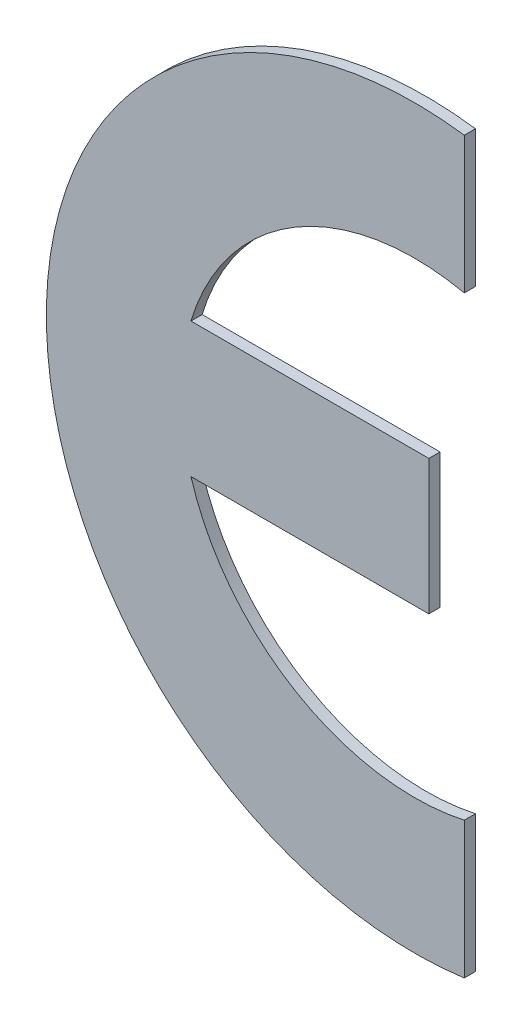
ISO-10303-21;
HEADER;
FILE_DESCRIPTION(('STEP AP214'),'2;1');
FILE_NAME('part.step','',(''),(''),'','','');
FILE_SCHEMA(('AUTOMOTIVE_DESIGN { 1 0 10303 214 1 1 1 1 }'));
ENDSEC;
DATA;
#1=APPLICATION_CONTEXT('core data for automotive mechanical design processes');
#2=APPLICATION_PROTOCOL_DEFINITION('international standard','automotive_design',2000,#1);
#3=PRODUCT_CONTEXT('',#1,'mechanical');
#4=PRODUCT('Part','Part','',(#3));
#5=PRODUCT_RELATED_PRODUCT_CATEGORY('part','',(#4));
#6=PRODUCT_DEFINITION_FORMATION('','',#4);
#7=PRODUCT_DEFINITION_CONTEXT('part definition',#1,'design');
#8=PRODUCT_DEFINITION('design','',#6,#7);
#9=PRODUCT_DEFINITION_SHAPE('','',#8);
#10=(LENGTH_UNIT() NAMED_UNIT(*) SI_UNIT(.MILLI.,.METRE.));
#11=(NAMED_UNIT(*) PLANE_ANGLE_UNIT() SI_UNIT($,.RADIAN.));
#12=(NAMED_UNIT(*) SI_UNIT($,.STERADIAN.) SOLID_ANGLE_UNIT());
#13=UNCERTAINTY_MEASURE_WITH_UNIT(LENGTH_MEASURE(1.E-05),#10,'distance_accuracy_value','');
#14=(GEOMETRIC_REPRESENTATION_CONTEXT(3) GLOBAL_UNCERTAINTY_ASSIGNED_CONTEXT((#13)) GLOBAL_UNIT_ASSIGNED_CONTEXT((#10,
#11,#12)) REPRESENTATION_CONTEXT('',''));
#15=CARTESIAN_POINT('',(0.,0.,0.));
#16=DIRECTION('',(0.,0.,1.));
#17=DIRECTION('',(1.,0.,0.));
#18=AXIS2_PLACEMENT_3D('',#15,#16,#17);
#19=CARTESIAN_POINT('',(0.,0.,0.05));
#20=DIRECTION('',(0.,0.,1.));
#21=DIRECTION('',(1.,0.,0.));
#22=AXIS2_PLACEMENT_3D('',#19,#20,#21);
#23=PLANE('',#22);
#24=DIRECTION('',(1.,0.,0.));
#25=VECTOR('',#24,1.);
#26=CARTESIAN_POINT('',(0.,0.328359,0.05));
#27=LINE('',#26,#25);
#28=CARTESIAN_POINT('',(1.982823,0.328359,0.05));
#29=VERTEX_POINT('',#28);
#30=CARTESIAN_POINT('',(0.920420256608206,0.328359,0.05));
#31=VERTEX_POINT('',#30);
#32=EDGE_CURVE('E102',#29,#31,#27,.F.);
#33=ORIENTED_EDGE('',*,*,#32,.T.);
#34=CARTESIAN_POINT('',(1.919323509045,0.02771641749802,0.05));
#35=DIRECTION('',(0.,0.,1.));
#36=DIRECTION('',(1.,0.,0.));
#37=AXIS2_PLACEMENT_3D('',#34,#35,#36);
#38=CIRCLE('',#37,1.043165217088);
#39=CARTESIAN_POINT('',(2.140918,1.04707383848436,0.05));
#40=VERTEX_POINT('',#39);
#41=EDGE_CURVE('E126',#31,#40,#38,.F.);
#42=ORIENTED_EDGE('',*,*,#41,.T.);
#43=DIRECTION('',(0.,1.,0.));
#44=VECTOR('',#43,1.);
#45=CARTESIAN_POINT('',(2.140918,1.047073838484,0.05));
#46=LINE('',#45,#44);
#47=CARTESIAN_POINT('',(2.14091799999997,1.65716686517852,0.05));
#48=VERTEX_POINT('',#47);
#49=EDGE_CURVE('E128',#48,#40,#46,.F.);
#50=ORIENTED_EDGE('',*,*,#49,.F.);
#51=CARTESIAN_POINT('',(1.919322613215,0.0277175,0.05));
#52=DIRECTION('',(0.,0.,1.));
#53=DIRECTION('',(1.,0.,0.));
#54=AXIS2_PLACEMENT_3D('',#51,#52,#53);
#55=CIRCLE('',#54,1.644448159452);
#56=CARTESIAN_POINT('',(2.140918,-1.60173186517876,0.05));
#57=VERTEX_POINT('',#56);
#58=EDGE_CURVE('E123',#57,#48,#55,.F.);
#59=ORIENTED_EDGE('',*,*,#58,.F.);
#60=DIRECTION('',(0.,1.,0.));
#61=VECTOR('',#60,1.);
#62=CARTESIAN_POINT('',(2.140918,0.,0.05));
#63=LINE('',#62,#61);
#64=CARTESIAN_POINT('',(2.14091800000002,-0.991637560477028,0.05));
#65=VERTEX_POINT('',#64);
#66=EDGE_CURVE('E79',#57,#65,#63,.T.);
#67=ORIENTED_EDGE('',*,*,#66,.T.);
#68=CARTESIAN_POINT('',(1.91932029307,0.02771576818233,0.05));
#69=DIRECTION('',(0.,0.,1.));
#70=DIRECTION('',(1.,0.,0.));
#71=AXIS2_PLACEMENT_3D('',#68,#69,#70);
#72=CIRCLE('',#71,1.04316190132);
#73=CARTESIAN_POINT('',(0.920420258236902,-0.272926,0.05));
#74=VERTEX_POINT('',#73);
#75=EDGE_CURVE('E20',#65,#74,#72,.F.);
#76=ORIENTED_EDGE('',*,*,#75,.T.);
#77=DIRECTION('',(1.,0.,0.));
#78=VECTOR('',#77,1.);
#79=CARTESIAN_POINT('',(0.,-0.272926,0.05));
#80=LINE('',#79,#78);
#81=CARTESIAN_POINT('',(1.982823,-0.272926,0.05));
#82=VERTEX_POINT('',#81);
#83=EDGE_CURVE('E84',#74,#82,#80,.T.);
#84=ORIENTED_EDGE('',*,*,#83,.T.);
#85=DIRECTION('',(0.,1.,0.));
#86=VECTOR('',#85,1.);
#87=CARTESIAN_POINT('',(1.982823,0.,0.05));
#88=LINE('',#87,#86);
#89=EDGE_CURVE('E100',#82,#29,#88,.T.);
#90=ORIENTED_EDGE('',*,*,#89,.T.);
#91=EDGE_LOOP('',(#33,#42,#50,#59,#67,#76,#84,#90));
#92=FACE_BOUND('',#91,.T.);
#93=ADVANCED_FACE('F17',(#92),#23,.T.);
#94=CARTESIAN_POINT('',(1.919323509045,0.02771641749802,0.));
#95=DIRECTION('',(0.,0.,1.));
#96=DIRECTION('',(1.,0.,0.));
#97=AXIS2_PLACEMENT_3D('',#94,#95,#96);
#98=CYLINDRICAL_SURFACE('',#97,1.043165217088);
#99=ORIENTED_EDGE('',*,*,#41,.F.);
#100=DIRECTION('',(0.,0.,1.));
#101=VECTOR('',#100,1.);
#102=CARTESIAN_POINT('',(0.9204202566082,0.328359,0.));
#103=LINE('',#102,#101);
#104=CARTESIAN_POINT('',(0.920420256608206,0.328359,0.));
#105=VERTEX_POINT('',#104);
#106=EDGE_CURVE('E142',#105,#31,#103,.T.);
#107=ORIENTED_EDGE('',*,*,#106,.F.);
#108=CARTESIAN_POINT('',(1.919323509045,0.02771641749802,0.));
#109=DIRECTION('',(0.,0.,1.));
#110=DIRECTION('',(1.,0.,0.));
#111=AXIS2_PLACEMENT_3D('',#108,#109,#110);
#112=CIRCLE('',#111,1.043165217088);
#113=CARTESIAN_POINT('',(2.140918,1.04707383848436,0.));
#114=VERTEX_POINT('',#113);
#115=EDGE_CURVE('E120',#105,#114,#112,.F.);
#116=ORIENTED_EDGE('',*,*,#115,.T.);
#117=DIRECTION('',(0.,0.,-1.));
#118=VECTOR('',#117,1.);
#119=CARTESIAN_POINT('',(2.140918,1.047073838484,0.));
#120=LINE('',#119,#118);
#121=EDGE_CURVE('E125',#40,#114,#120,.T.);
#122=ORIENTED_EDGE('',*,*,#121,.F.);
#123=EDGE_LOOP('',(#99,#107,#116,#122));
#124=FACE_BOUND('',#123,.T.);
#125=ADVANCED_FACE('F169',(#124),#98,.F.);
#126=CARTESIAN_POINT('',(2.140918,1.047073838484,0.));
#127=DIRECTION('',(1.,0.,0.));
#128=DIRECTION('',(0.,0.,-1.));
#129=AXIS2_PLACEMENT_3D('',#126,#127,#128);
#130=PLANE('',#129);
#131=ORIENTED_EDGE('',*,*,#121,.T.);
#132=DIRECTION('',(0.,1.,0.));
#133=VECTOR('',#132,1.);
#134=CARTESIAN_POINT('',(2.140918,0.,0.));
#135=LINE('',#134,#133);
#136=CARTESIAN_POINT('',(2.14091799999997,1.65716686517852,0.));
#137=VERTEX_POINT('',#136);
#138=EDGE_CURVE('E119',#114,#137,#135,.T.);
#139=ORIENTED_EDGE('',*,*,#138,.T.);
#140=DIRECTION('',(0.,0.,1.));
#141=VECTOR('',#140,1.);
#142=CARTESIAN_POINT('',(2.14091799999994,1.65716686517853,0.));
#143=LINE('',#142,#141);
#144=EDGE_CURVE('E124',#48,#137,#143,.F.);
#145=ORIENTED_EDGE('',*,*,#144,.F.);
#146=ORIENTED_EDGE('',*,*,#49,.T.);
#147=EDGE_LOOP('',(#131,#139,#145,#146));
#148=FACE_BOUND('',#147,.T.);
#149=ADVANCED_FACE('F172',(#148),#130,.T.);
#150=CARTESIAN_POINT('',(1.919322613215,0.0277175,0.));
#151=DIRECTION('',(0.,0.,1.));
#152=DIRECTION('',(1.,0.,0.));
#153=AXIS2_PLACEMENT_3D('',#150,#151,#152);
#154=CYLINDRICAL_SURFACE('',#153,1.644448159452);
#155=ORIENTED_EDGE('',*,*,#144,.T.);
#156=CARTESIAN_POINT('',(1.919322613215,0.0277175,0.));
#157=DIRECTION('',(0.,0.,1.));
#158=DIRECTION('',(1.,0.,0.));
#159=AXIS2_PLACEMENT_3D('',#156,#157,#158);
#160=CIRCLE('',#159,1.644448159452);
#161=CARTESIAN_POINT('',(2.140918,-1.60173186517876,0.));
#162=VERTEX_POINT('',#161);
#163=EDGE_CURVE('E116',#137,#162,#160,.T.);
#164=ORIENTED_EDGE('',*,*,#163,.T.);
#165=DIRECTION('',(0.,0.,-1.));
#166=VECTOR('',#165,1.);
#167=CARTESIAN_POINT('',(2.140918,-1.601731865179,0.));
#168=LINE('',#167,#166);
#169=EDGE_CURVE('E136',#57,#162,#168,.T.);
#170=ORIENTED_EDGE('',*,*,#169,.F.);
#171=ORIENTED_EDGE('',*,*,#58,.T.);
#172=EDGE_LOOP('',(#155,#164,#170,#171));
#173=FACE_BOUND('',#172,.T.);
#174=ADVANCED_FACE('F177',(#173),#154,.T.);
#175=CARTESIAN_POINT('',(2.140918,-1.601731865179,0.));
#176=DIRECTION('',(1.,0.,0.));
#177=DIRECTION('',(0.,0.,-1.));
#178=AXIS2_PLACEMENT_3D('',#175,#176,#177);
#179=PLANE('',#178);
#180=ORIENTED_EDGE('',*,*,#169,.T.);
#181=DIRECTION('',(0.,1.,0.));
#182=VECTOR('',#181,1.);
#183=CARTESIAN_POINT('',(2.140918,0.,0.));
#184=LINE('',#183,#182);
#185=CARTESIAN_POINT('',(2.14091800000002,-0.991637560477028,0.));
#186=VERTEX_POINT('',#185);
#187=EDGE_CURVE('E115',#162,#186,#184,.T.);
#188=ORIENTED_EDGE('',*,*,#187,.T.);
#189=DIRECTION('',(0.,0.,1.));
#190=VECTOR('',#189,1.);
#191=CARTESIAN_POINT('',(2.14091800000005,-0.991637560477022,0.));
#192=LINE('',#191,#190);
#193=EDGE_CURVE('E96',#186,#65,#192,.T.);
#194=ORIENTED_EDGE('',*,*,#193,.T.);
#195=ORIENTED_EDGE('',*,*,#66,.F.);
#196=EDGE_LOOP('',(#180,#188,#194,#195));
#197=FACE_BOUND('',#196,.T.);
#198=ADVANCED_FACE('F179',(#197),#179,.T.);
#199=CARTESIAN_POINT('',(1.91932029307,0.02771576818233,0.));
#200=DIRECTION('',(0.,0.,1.));
#201=DIRECTION('',(1.,0.,0.));
#202=AXIS2_PLACEMENT_3D('',#199,#200,#201);
#203=CYLINDRICAL_SURFACE('',#202,1.04316190132);
#204=ORIENTED_EDGE('',*,*,#75,.F.);
#205=ORIENTED_EDGE('',*,*,#193,.F.);
#206=CARTESIAN_POINT('',(1.91932029307,0.02771576818233,0.));
#207=DIRECTION('',(0.,0.,1.));
#208=DIRECTION('',(1.,0.,0.));
#209=AXIS2_PLACEMENT_3D('',#206,#207,#208);
#210=CIRCLE('',#209,1.04316190132);
#211=CARTESIAN_POINT('',(0.920420258236902,-0.272926,0.));
#212=VERTEX_POINT('',#211);
#213=EDGE_CURVE('E91',#186,#212,#210,.F.);
#214=ORIENTED_EDGE('',*,*,#213,.T.);
#215=DIRECTION('',(0.,0.,-1.));
#216=VECTOR('',#215,1.);
#217=CARTESIAN_POINT('',(0.920420258237,-0.272926,0.));
#218=LINE('',#217,#216);
#219=EDGE_CURVE('E88',#74,#212,#218,.T.);
#220=ORIENTED_EDGE('',*,*,#219,.F.);
#221=EDGE_LOOP('',(#204,#205,#214,#220));
#222=FACE_BOUND('',#221,.T.);
#223=ADVANCED_FACE('F89',(#222),#203,.F.);
#224=CARTESIAN_POINT('',(0.920420258237,-0.272926,0.));
#225=DIRECTION('',(0.,-1.,0.));
#226=DIRECTION('',(0.,0.,-1.));
#227=AXIS2_PLACEMENT_3D('',#224,#225,#226);
#228=PLANE('',#227);
#229=ORIENTED_EDGE('',*,*,#219,.T.);
#230=DIRECTION('',(1.,0.,0.));
#231=VECTOR('',#230,1.);
#232=CARTESIAN_POINT('',(0.,-0.272926,0.));
#233=LINE('',#232,#231);
#234=CARTESIAN_POINT('',(1.982823,-0.272926,0.));
#235=VERTEX_POINT('',#234);
#236=EDGE_CURVE('E114',#212,#235,#233,.T.);
#237=ORIENTED_EDGE('',*,*,#236,.T.);
#238=DIRECTION('',(0.,0.,-1.));
#239=VECTOR('',#238,1.);
#240=CARTESIAN_POINT('',(1.982823,-0.272926,0.));
#241=LINE('',#240,#239);
#242=EDGE_CURVE('E95',#82,#235,#241,.T.);
#243=ORIENTED_EDGE('',*,*,#242,.F.);
#244=ORIENTED_EDGE('',*,*,#83,.F.);
#245=EDGE_LOOP('',(#229,#237,#243,#244));
#246=FACE_BOUND('',#245,.T.);
#247=ADVANCED_FACE('F98',(#246),#228,.T.);
#248=CARTESIAN_POINT('',(1.982823,-0.272926,0.));
#249=DIRECTION('',(1.,0.,0.));
#250=DIRECTION('',(0.,0.,-1.));
#251=AXIS2_PLACEMENT_3D('',#248,#249,#250);
#252=PLANE('',#251);
#253=ORIENTED_EDGE('',*,*,#242,.T.);
#254=DIRECTION('',(0.,1.,0.));
#255=VECTOR('',#254,1.);
#256=CARTESIAN_POINT('',(1.982823,0.,0.));
#257=LINE('',#256,#255);
#258=CARTESIAN_POINT('',(1.982823,0.328359,0.));
#259=VERTEX_POINT('',#258);
#260=EDGE_CURVE('E26',#235,#259,#257,.T.);
#261=ORIENTED_EDGE('',*,*,#260,.T.);
#262=DIRECTION('',(0.,0.,1.));
#263=VECTOR('',#262,1.);
#264=CARTESIAN_POINT('',(1.982823,0.328359,0.));
#265=LINE('',#264,#263);
#266=EDGE_CURVE('E34',#29,#259,#265,.F.);
#267=ORIENTED_EDGE('',*,*,#266,.F.);
#268=ORIENTED_EDGE('',*,*,#89,.F.);
#269=EDGE_LOOP('',(#253,#261,#267,#268));
#270=FACE_BOUND('',#269,.T.);
#271=ADVANCED_FACE('F165',(#270),#252,.T.);
#272=CARTESIAN_POINT('',(1.982823,0.328359,0.));
#273=DIRECTION('',(0.,1.,0.));
#274=DIRECTION('',(0.,0.,1.));
#275=AXIS2_PLACEMENT_3D('',#272,#273,#274);
#276=PLANE('',#275);
#277=ORIENTED_EDGE('',*,*,#266,.T.);
#278=DIRECTION('',(1.,0.,0.));
#279=VECTOR('',#278,1.);
#280=CARTESIAN_POINT('',(0.,0.328359,0.));
#281=LINE('',#280,#279);
#282=EDGE_CURVE('E11',#259,#105,#281,.F.);
#283=ORIENTED_EDGE('',*,*,#282,.T.);
#284=ORIENTED_EDGE('',*,*,#106,.T.);
#285=ORIENTED_EDGE('',*,*,#32,.F.);
#286=EDGE_LOOP('',(#277,#283,#284,#285));
#287=FACE_BOUND('',#286,.T.);
#288=ADVANCED_FACE('F166',(#287),#276,.T.);
#289=CARTESIAN_POINT('',(0.,0.,0.));
#290=DIRECTION('',(0.,0.,1.));
#291=DIRECTION('',(1.,0.,0.));
#292=AXIS2_PLACEMENT_3D('',#289,#290,#291);
#293=PLANE('',#292);
#294=ORIENTED_EDGE('',*,*,#260,.F.);
#295=ORIENTED_EDGE('',*,*,#236,.F.);
#296=ORIENTED_EDGE('',*,*,#213,.F.);
#297=ORIENTED_EDGE('',*,*,#187,.F.);
#298=ORIENTED_EDGE('',*,*,#163,.F.);
#299=ORIENTED_EDGE('',*,*,#138,.F.);
#300=ORIENTED_EDGE('',*,*,#115,.F.);
#301=ORIENTED_EDGE('',*,*,#282,.F.);
#302=EDGE_LOOP('',(#294,#295,#296,#297,#298,#299,#300,#301));
#303=FACE_BOUND('',#302,.T.);
#304=ADVANCED_FACE('F162',(#303),#293,.F.);
#305=CLOSED_SHELL('',(#93,#125,#149,#174,#198,#223,#247,#271,#288,#304));
#306=MANIFOLD_SOLID_BREP('B1',#305);
#307=ADVANCED_BREP_SHAPE_REPRESENTATION('',(#18,#306),#14);
#308=SHAPE_DEFINITION_REPRESENTATION(#9,#307);
ENDSEC;
END-ISO-10303-21;
